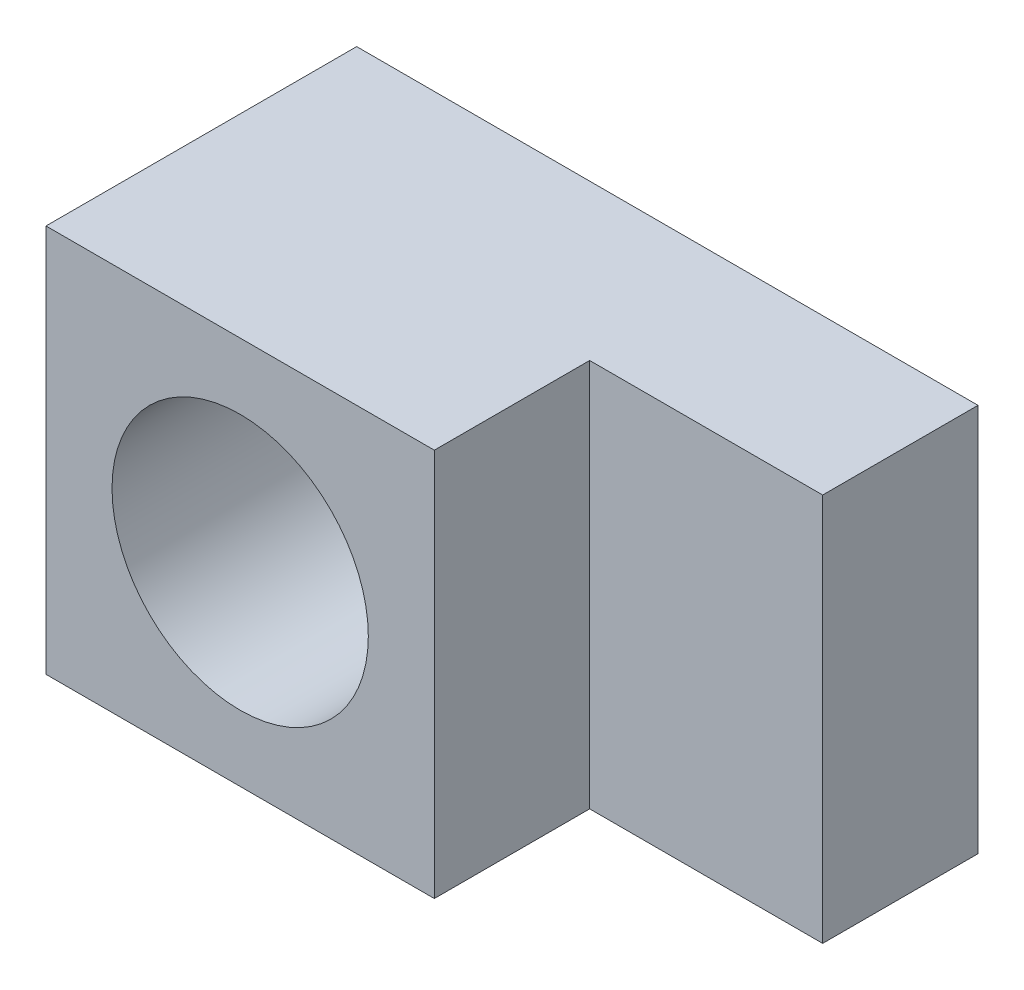
ISO-10303-21;
HEADER;
FILE_DESCRIPTION(('STEP AP214'),'2;1');
FILE_NAME('part.step','',(''),(''),'','','');
FILE_SCHEMA(('AUTOMOTIVE_DESIGN { 1 0 10303 214 1 1 1 1 }'));
ENDSEC;
DATA;
#1=APPLICATION_CONTEXT('core data for automotive mechanical design processes');
#2=APPLICATION_PROTOCOL_DEFINITION('international standard','automotive_design',2000,#1);
#3=PRODUCT_CONTEXT('',#1,'mechanical');
#4=PRODUCT('Part','Part','',(#3));
#5=PRODUCT_RELATED_PRODUCT_CATEGORY('part','',(#4));
#6=PRODUCT_DEFINITION_FORMATION('','',#4);
#7=PRODUCT_DEFINITION_CONTEXT('part definition',#1,'design');
#8=PRODUCT_DEFINITION('design','',#6,#7);
#9=PRODUCT_DEFINITION_SHAPE('','',#8);
#10=(LENGTH_UNIT() NAMED_UNIT(*) SI_UNIT(.MILLI.,.METRE.));
#11=(NAMED_UNIT(*) PLANE_ANGLE_UNIT() SI_UNIT($,.RADIAN.));
#12=(NAMED_UNIT(*) SI_UNIT($,.STERADIAN.) SOLID_ANGLE_UNIT());
#13=UNCERTAINTY_MEASURE_WITH_UNIT(LENGTH_MEASURE(1.E-05),#10,'distance_accuracy_value','');
#14=(GEOMETRIC_REPRESENTATION_CONTEXT(3) GLOBAL_UNCERTAINTY_ASSIGNED_CONTEXT((#13)) GLOBAL_UNIT_ASSIGNED_CONTEXT((#10,
#11,#12)) REPRESENTATION_CONTEXT('',''));
#15=CARTESIAN_POINT('',(0.,0.,0.));
#16=DIRECTION('',(0.,0.,1.));
#17=DIRECTION('',(1.,0.,0.));
#18=AXIS2_PLACEMENT_3D('',#15,#16,#17);
#19=CARTESIAN_POINT('',(0.,0.,4.));
#20=DIRECTION('',(0.,0.,1.));
#21=DIRECTION('',(1.,0.,0.));
#22=AXIS2_PLACEMENT_3D('',#19,#20,#21);
#23=PLANE('',#22);
#24=CARTESIAN_POINT('',(-1.5,0.,4.));
#25=DIRECTION('',(0.,0.,1.));
#26=DIRECTION('',(1.,0.,0.));
#27=AXIS2_PLACEMENT_3D('',#24,#25,#26);
#28=CIRCLE('',#27,1.65);
#29=CARTESIAN_POINT('',(0.15,0.,4.));
#30=VERTEX_POINT('',#29);
#31=EDGE_CURVE('E147',#30,#30,#28,.T.);
#32=ORIENTED_EDGE('',*,*,#31,.F.);
#33=EDGE_LOOP('',(#32));
#34=FACE_BOUND('',#33,.T.);
#35=DIRECTION('',(1.,0.,0.));
#36=VECTOR('',#35,1.);
#37=CARTESIAN_POINT('',(-4.,-2.5,4.));
#38=LINE('',#37,#36);
#39=CARTESIAN_POINT('',(-4.,-2.5,4.));
#40=VERTEX_POINT('',#39);
#41=CARTESIAN_POINT('',(1.,-2.5,4.));
#42=VERTEX_POINT('',#41);
#43=EDGE_CURVE('E88',#40,#42,#38,.T.);
#44=ORIENTED_EDGE('',*,*,#43,.T.);
#45=DIRECTION('',(0.,-1.,0.));
#46=VECTOR('',#45,1.);
#47=CARTESIAN_POINT('',(1.,2.5,4.));
#48=LINE('',#47,#46);
#49=CARTESIAN_POINT('',(1.,2.5,4.));
#50=VERTEX_POINT('',#49);
#51=EDGE_CURVE('E139',#50,#42,#48,.T.);
#52=ORIENTED_EDGE('',*,*,#51,.F.);
#53=DIRECTION('',(-1.,0.,0.));
#54=VECTOR('',#53,1.);
#55=CARTESIAN_POINT('',(-4.,2.5,4.));
#56=LINE('',#55,#54);
#57=CARTESIAN_POINT('',(-4.,2.5,4.));
#58=VERTEX_POINT('',#57);
#59=EDGE_CURVE('E97',#50,#58,#56,.T.);
#60=ORIENTED_EDGE('',*,*,#59,.T.);
#61=DIRECTION('',(0.,-1.,0.));
#62=VECTOR('',#61,1.);
#63=CARTESIAN_POINT('',(-4.,2.5,4.));
#64=LINE('',#63,#62);
#65=EDGE_CURVE('E58',#58,#40,#64,.T.);
#66=ORIENTED_EDGE('',*,*,#65,.T.);
#67=EDGE_LOOP('',(#44,#52,#60,#66));
#68=FACE_BOUND('',#67,.T.);
#69=ADVANCED_FACE('F33',(#34,#68),#23,.T.);
#70=CARTESIAN_POINT('',(4.,2.5,4.));
#71=DIRECTION('',(-1.,0.,0.));
#72=DIRECTION('',(0.,0.,1.));
#73=AXIS2_PLACEMENT_3D('',#70,#71,#72);
#74=PLANE('',#73);
#75=DIRECTION('',(0.,0.,-1.));
#76=VECTOR('',#75,1.);
#77=CARTESIAN_POINT('',(4.,2.5,4.));
#78=LINE('',#77,#76);
#79=CARTESIAN_POINT('',(4.,2.5,2.));
#80=VERTEX_POINT('',#79);
#81=CARTESIAN_POINT('',(4.,2.5,0.));
#82=VERTEX_POINT('',#81);
#83=EDGE_CURVE('E11',#80,#82,#78,.T.);
#84=ORIENTED_EDGE('',*,*,#83,.F.);
#85=DIRECTION('',(0.,1.,0.));
#86=VECTOR('',#85,1.);
#87=CARTESIAN_POINT('',(4.,2.5,2.));
#88=LINE('',#87,#86);
#89=CARTESIAN_POINT('',(4.,-2.5,2.));
#90=VERTEX_POINT('',#89);
#91=EDGE_CURVE('E84',#90,#80,#88,.T.);
#92=ORIENTED_EDGE('',*,*,#91,.F.);
#93=DIRECTION('',(0.,0.,-1.));
#94=VECTOR('',#93,1.);
#95=CARTESIAN_POINT('',(4.,-2.5,4.));
#96=LINE('',#95,#94);
#97=CARTESIAN_POINT('',(4.,-2.5,0.));
#98=VERTEX_POINT('',#97);
#99=EDGE_CURVE('E77',#90,#98,#96,.T.);
#100=ORIENTED_EDGE('',*,*,#99,.T.);
#101=DIRECTION('',(0.,1.,0.));
#102=VECTOR('',#101,1.);
#103=CARTESIAN_POINT('',(4.,2.5,0.));
#104=LINE('',#103,#102);
#105=EDGE_CURVE('E81',#98,#82,#104,.T.);
#106=ORIENTED_EDGE('',*,*,#105,.T.);
#107=EDGE_LOOP('',(#84,#92,#100,#106));
#108=FACE_BOUND('',#107,.T.);
#109=ADVANCED_FACE('F35',(#108),#74,.F.);
#110=CARTESIAN_POINT('',(-4.,2.5,4.));
#111=DIRECTION('',(0.,-1.,0.));
#112=DIRECTION('',(0.,0.,-1.));
#113=AXIS2_PLACEMENT_3D('',#110,#111,#112);
#114=PLANE('',#113);
#115=DIRECTION('',(0.,0.,1.));
#116=VECTOR('',#115,1.);
#117=CARTESIAN_POINT('',(1.,2.5,4.));
#118=LINE('',#117,#116);
#119=CARTESIAN_POINT('',(1.,2.5,2.));
#120=VERTEX_POINT('',#119);
#121=EDGE_CURVE('E49',#120,#50,#118,.T.);
#122=ORIENTED_EDGE('',*,*,#121,.F.);
#123=DIRECTION('',(1.,0.,0.));
#124=VECTOR('',#123,1.);
#125=CARTESIAN_POINT('',(1.,2.5,2.));
#126=LINE('',#125,#124);
#127=EDGE_CURVE('E103',#120,#80,#126,.T.);
#128=ORIENTED_EDGE('',*,*,#127,.T.);
#129=ORIENTED_EDGE('',*,*,#83,.T.);
#130=DIRECTION('',(-1.,0.,0.));
#131=VECTOR('',#130,1.);
#132=CARTESIAN_POINT('',(-4.,2.5,0.));
#133=LINE('',#132,#131);
#134=CARTESIAN_POINT('',(-4.,2.5,0.));
#135=VERTEX_POINT('',#134);
#136=EDGE_CURVE('E102',#82,#135,#133,.T.);
#137=ORIENTED_EDGE('',*,*,#136,.T.);
#138=DIRECTION('',(0.,0.,-1.));
#139=VECTOR('',#138,1.);
#140=CARTESIAN_POINT('',(-4.,2.5,4.));
#141=LINE('',#140,#139);
#142=EDGE_CURVE('E42',#58,#135,#141,.T.);
#143=ORIENTED_EDGE('',*,*,#142,.F.);
#144=ORIENTED_EDGE('',*,*,#59,.F.);
#145=EDGE_LOOP('',(#122,#128,#129,#137,#143,#144));
#146=FACE_BOUND('',#145,.T.);
#147=ADVANCED_FACE('F120',(#146),#114,.F.);
#148=CARTESIAN_POINT('',(-4.,2.5,4.));
#149=DIRECTION('',(1.,0.,0.));
#150=DIRECTION('',(0.,0.,-1.));
#151=AXIS2_PLACEMENT_3D('',#148,#149,#150);
#152=PLANE('',#151);
#153=DIRECTION('',(0.,-1.,0.));
#154=VECTOR('',#153,1.);
#155=CARTESIAN_POINT('',(-4.,2.5,0.));
#156=LINE('',#155,#154);
#157=CARTESIAN_POINT('',(-4.,-2.5,0.));
#158=VERTEX_POINT('',#157);
#159=EDGE_CURVE('E98',#135,#158,#156,.T.);
#160=ORIENTED_EDGE('',*,*,#159,.T.);
#161=DIRECTION('',(0.,0.,-1.));
#162=VECTOR('',#161,1.);
#163=CARTESIAN_POINT('',(-4.,-2.5,4.));
#164=LINE('',#163,#162);
#165=EDGE_CURVE('E87',#40,#158,#164,.T.);
#166=ORIENTED_EDGE('',*,*,#165,.F.);
#167=ORIENTED_EDGE('',*,*,#65,.F.);
#168=ORIENTED_EDGE('',*,*,#142,.T.);
#169=EDGE_LOOP('',(#160,#166,#167,#168));
#170=FACE_BOUND('',#169,.T.);
#171=ADVANCED_FACE('F117',(#170),#152,.F.);
#172=CARTESIAN_POINT('',(-4.,-2.5,4.));
#173=DIRECTION('',(0.,1.,0.));
#174=DIRECTION('',(0.,0.,1.));
#175=AXIS2_PLACEMENT_3D('',#172,#173,#174);
#176=PLANE('',#175);
#177=ORIENTED_EDGE('',*,*,#99,.F.);
#178=DIRECTION('',(1.,0.,0.));
#179=VECTOR('',#178,1.);
#180=CARTESIAN_POINT('',(1.,-2.5,2.));
#181=LINE('',#180,#179);
#182=CARTESIAN_POINT('',(1.,-2.5,2.));
#183=VERTEX_POINT('',#182);
#184=EDGE_CURVE('E107',#183,#90,#181,.T.);
#185=ORIENTED_EDGE('',*,*,#184,.F.);
#186=DIRECTION('',(0.,0.,-1.));
#187=VECTOR('',#186,1.);
#188=CARTESIAN_POINT('',(1.,-2.5,4.));
#189=LINE('',#188,#187);
#190=EDGE_CURVE('E135',#42,#183,#189,.T.);
#191=ORIENTED_EDGE('',*,*,#190,.F.);
#192=ORIENTED_EDGE('',*,*,#43,.F.);
#193=ORIENTED_EDGE('',*,*,#165,.T.);
#194=DIRECTION('',(1.,0.,0.));
#195=VECTOR('',#194,1.);
#196=CARTESIAN_POINT('',(-4.,-2.5,0.));
#197=LINE('',#196,#195);
#198=EDGE_CURVE('E92',#158,#98,#197,.T.);
#199=ORIENTED_EDGE('',*,*,#198,.T.);
#200=EDGE_LOOP('',(#177,#185,#191,#192,#193,#199));
#201=FACE_BOUND('',#200,.T.);
#202=ADVANCED_FACE('F93',(#201),#176,.F.);
#203=CARTESIAN_POINT('',(0.,0.,0.));
#204=DIRECTION('',(0.,0.,1.));
#205=DIRECTION('',(1.,0.,0.));
#206=AXIS2_PLACEMENT_3D('',#203,#204,#205);
#207=PLANE('',#206);
#208=CARTESIAN_POINT('',(-1.5,0.,0.));
#209=DIRECTION('',(0.,0.,1.));
#210=DIRECTION('',(1.,0.,0.));
#211=AXIS2_PLACEMENT_3D('',#208,#209,#210);
#212=CIRCLE('',#211,1.65);
#213=CARTESIAN_POINT('',(0.15,0.,0.));
#214=VERTEX_POINT('',#213);
#215=EDGE_CURVE('E37',#214,#214,#212,.T.);
#216=ORIENTED_EDGE('',*,*,#215,.T.);
#217=EDGE_LOOP('',(#216));
#218=FACE_BOUND('',#217,.T.);
#219=ORIENTED_EDGE('',*,*,#105,.F.);
#220=ORIENTED_EDGE('',*,*,#198,.F.);
#221=ORIENTED_EDGE('',*,*,#159,.F.);
#222=ORIENTED_EDGE('',*,*,#136,.F.);
#223=EDGE_LOOP('',(#219,#220,#221,#222));
#224=FACE_BOUND('',#223,.T.);
#225=ADVANCED_FACE('F101',(#218,#224),#207,.F.);
#226=CARTESIAN_POINT('',(1.,2.5,2.));
#227=DIRECTION('',(0.,0.,-1.));
#228=DIRECTION('',(-1.,0.,0.));
#229=AXIS2_PLACEMENT_3D('',#226,#227,#228);
#230=PLANE('',#229);
#231=ORIENTED_EDGE('',*,*,#91,.T.);
#232=ORIENTED_EDGE('',*,*,#127,.F.);
#233=DIRECTION('',(0.,1.,0.));
#234=VECTOR('',#233,1.);
#235=CARTESIAN_POINT('',(1.,2.5,2.));
#236=LINE('',#235,#234);
#237=EDGE_CURVE('E132',#183,#120,#236,.T.);
#238=ORIENTED_EDGE('',*,*,#237,.F.);
#239=ORIENTED_EDGE('',*,*,#184,.T.);
#240=EDGE_LOOP('',(#231,#232,#238,#239));
#241=FACE_BOUND('',#240,.T.);
#242=ADVANCED_FACE('F134',(#241),#230,.F.);
#243=CARTESIAN_POINT('',(1.,0.,0.));
#244=DIRECTION('',(1.,0.,0.));
#245=DIRECTION('',(0.,0.,-1.));
#246=AXIS2_PLACEMENT_3D('',#243,#244,#245);
#247=PLANE('',#246);
#248=ORIENTED_EDGE('',*,*,#51,.T.);
#249=ORIENTED_EDGE('',*,*,#190,.T.);
#250=ORIENTED_EDGE('',*,*,#237,.T.);
#251=ORIENTED_EDGE('',*,*,#121,.T.);
#252=EDGE_LOOP('',(#248,#249,#250,#251));
#253=FACE_BOUND('',#252,.T.);
#254=ADVANCED_FACE('F138',(#253),#247,.T.);
#255=CARTESIAN_POINT('',(-1.5,0.,-1.));
#256=DIRECTION('',(0.,0.,1.));
#257=DIRECTION('',(1.,0.,0.));
#258=AXIS2_PLACEMENT_3D('',#255,#256,#257);
#259=CYLINDRICAL_SURFACE('',#258,1.65);
#260=ORIENTED_EDGE('',*,*,#31,.T.);
#261=EDGE_LOOP('',(#260));
#262=FACE_BOUND('',#261,.T.);
#263=ORIENTED_EDGE('',*,*,#215,.F.);
#264=EDGE_LOOP('',(#263));
#265=FACE_BOUND('',#264,.T.);
#266=ADVANCED_FACE('F155',(#262,#265),#259,.F.);
#267=CLOSED_SHELL('',(#69,#109,#147,#171,#202,#225,#242,#254,#266));
#268=MANIFOLD_SOLID_BREP('B2',#267);
#269=ADVANCED_BREP_SHAPE_REPRESENTATION('',(#18,#268),#14);
#270=SHAPE_DEFINITION_REPRESENTATION(#9,#269);
ENDSEC;
END-ISO-10303-21;
